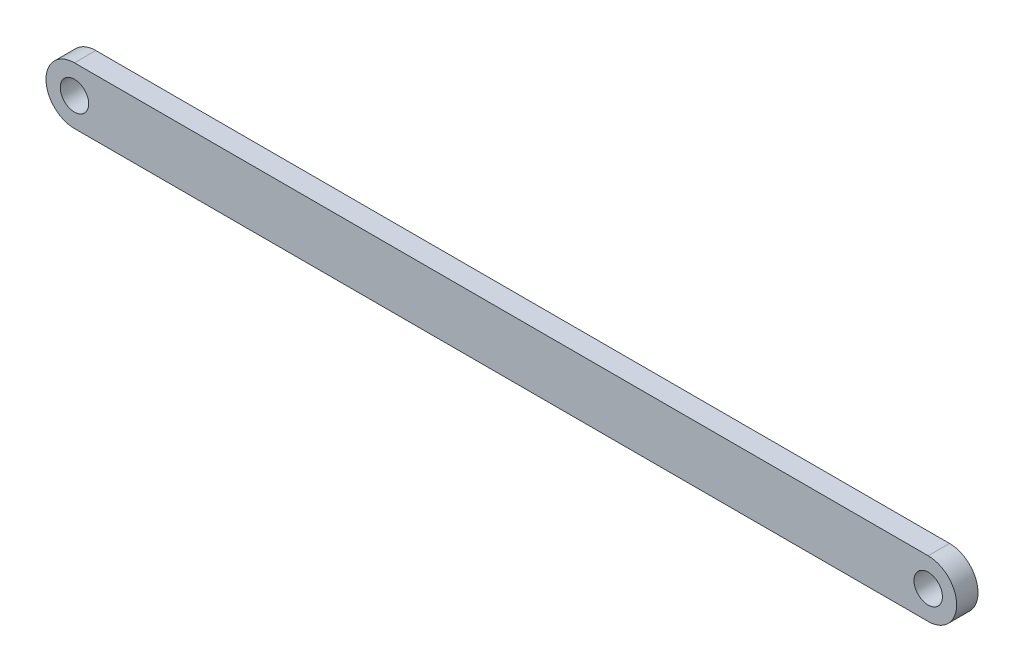
ISO-10303-21;
HEADER;
FILE_DESCRIPTION(('STEP AP214'),'2;1');
FILE_NAME('part.step','',(''),(''),'','','');
FILE_SCHEMA(('AUTOMOTIVE_DESIGN { 1 0 10303 214 1 1 1 1 }'));
ENDSEC;
DATA;
#1=APPLICATION_CONTEXT('core data for automotive mechanical design processes');
#2=APPLICATION_PROTOCOL_DEFINITION('international standard','automotive_design',2000,#1);
#3=PRODUCT_CONTEXT('',#1,'mechanical');
#4=PRODUCT('Part','Part','',(#3));
#5=PRODUCT_RELATED_PRODUCT_CATEGORY('part','',(#4));
#6=PRODUCT_DEFINITION_FORMATION('','',#4);
#7=PRODUCT_DEFINITION_CONTEXT('part definition',#1,'design');
#8=PRODUCT_DEFINITION('design','',#6,#7);
#9=PRODUCT_DEFINITION_SHAPE('','',#8);
#10=(LENGTH_UNIT() NAMED_UNIT(*) SI_UNIT(.MILLI.,.METRE.));
#11=(NAMED_UNIT(*) PLANE_ANGLE_UNIT() SI_UNIT($,.RADIAN.));
#12=(NAMED_UNIT(*) SI_UNIT($,.STERADIAN.) SOLID_ANGLE_UNIT());
#13=UNCERTAINTY_MEASURE_WITH_UNIT(LENGTH_MEASURE(1.E-05),#10,'distance_accuracy_value','');
#14=(GEOMETRIC_REPRESENTATION_CONTEXT(3) GLOBAL_UNCERTAINTY_ASSIGNED_CONTEXT((#13)) GLOBAL_UNIT_ASSIGNED_CONTEXT((#10,
#11,#12)) REPRESENTATION_CONTEXT('',''));
#15=CARTESIAN_POINT('',(0.,0.,0.));
#16=DIRECTION('',(0.,0.,1.));
#17=DIRECTION('',(1.,0.,0.));
#18=AXIS2_PLACEMENT_3D('',#15,#16,#17);
#19=CARTESIAN_POINT('',(0.,0.,1.5));
#20=DIRECTION('',(0.,0.,1.));
#21=DIRECTION('',(1.,0.,0.));
#22=AXIS2_PLACEMENT_3D('',#19,#20,#21);
#23=PLANE('',#22);
#24=CARTESIAN_POINT('',(60.,0.,1.5));
#25=DIRECTION('',(0.,0.,1.));
#26=DIRECTION('',(1.,0.,0.));
#27=AXIS2_PLACEMENT_3D('',#24,#25,#26);
#28=CIRCLE('',#27,0.999999999999998);
#29=CARTESIAN_POINT('',(61.,0.,1.5));
#30=VERTEX_POINT('',#29);
#31=EDGE_CURVE('E101',#30,#30,#28,.T.);
#32=ORIENTED_EDGE('',*,*,#31,.F.);
#33=EDGE_LOOP('',(#32));
#34=FACE_BOUND('',#33,.T.);
#35=CARTESIAN_POINT('',(0.,0.,1.5));
#36=DIRECTION('',(0.,0.,1.));
#37=DIRECTION('',(1.,0.,0.));
#38=AXIS2_PLACEMENT_3D('',#35,#36,#37);
#39=CIRCLE('',#38,2.);
#40=CARTESIAN_POINT('',(0.,2.,1.5));
#41=VERTEX_POINT('',#40);
#42=CARTESIAN_POINT('',(0.,-2.,1.5));
#43=VERTEX_POINT('',#42);
#44=EDGE_CURVE('E86',#41,#43,#39,.T.);
#45=ORIENTED_EDGE('',*,*,#44,.T.);
#46=DIRECTION('',(1.,0.,0.));
#47=VECTOR('',#46,1.);
#48=CARTESIAN_POINT('',(0.,-2.,1.5));
#49=LINE('',#48,#47);
#50=CARTESIAN_POINT('',(60.,-2.,1.5));
#51=VERTEX_POINT('',#50);
#52=EDGE_CURVE('E81',#43,#51,#49,.T.);
#53=ORIENTED_EDGE('',*,*,#52,.T.);
#54=CARTESIAN_POINT('',(60.,0.,1.5));
#55=DIRECTION('',(0.,0.,1.));
#56=DIRECTION('',(1.,0.,0.));
#57=AXIS2_PLACEMENT_3D('',#54,#55,#56);
#58=CIRCLE('',#57,2.);
#59=CARTESIAN_POINT('',(60.,2.,1.5));
#60=VERTEX_POINT('',#59);
#61=EDGE_CURVE('E84',#51,#60,#58,.T.);
#62=ORIENTED_EDGE('',*,*,#61,.T.);
#63=DIRECTION('',(-1.,0.,0.));
#64=VECTOR('',#63,1.);
#65=CARTESIAN_POINT('',(0.,2.,1.5));
#66=LINE('',#65,#64);
#67=EDGE_CURVE('E51',#60,#41,#66,.T.);
#68=ORIENTED_EDGE('',*,*,#67,.T.);
#69=EDGE_LOOP('',(#45,#53,#62,#68));
#70=FACE_BOUND('',#69,.T.);
#71=CARTESIAN_POINT('',(0.,0.,1.5));
#72=DIRECTION('',(0.,0.,1.));
#73=DIRECTION('',(1.,0.,0.));
#74=AXIS2_PLACEMENT_3D('',#71,#72,#73);
#75=CIRCLE('',#74,1.);
#76=CARTESIAN_POINT('',(1.,0.,1.5));
#77=VERTEX_POINT('',#76);
#78=EDGE_CURVE('E116',#77,#77,#75,.T.);
#79=ORIENTED_EDGE('',*,*,#78,.F.);
#80=EDGE_LOOP('',(#79));
#81=FACE_BOUND('',#80,.T.);
#82=ADVANCED_FACE('F34',(#34,#70,#81),#23,.T.);
#83=CARTESIAN_POINT('',(0.,0.,0.));
#84=DIRECTION('',(0.,0.,1.));
#85=DIRECTION('',(1.,0.,0.));
#86=AXIS2_PLACEMENT_3D('',#83,#84,#85);
#87=PLANE('',#86);
#88=CARTESIAN_POINT('',(0.,0.,0.));
#89=DIRECTION('',(0.,0.,1.));
#90=DIRECTION('',(1.,0.,0.));
#91=AXIS2_PLACEMENT_3D('',#88,#89,#90);
#92=CIRCLE('',#91,2.);
#93=CARTESIAN_POINT('',(0.,2.,0.));
#94=VERTEX_POINT('',#93);
#95=CARTESIAN_POINT('',(0.,-2.,0.));
#96=VERTEX_POINT('',#95);
#97=EDGE_CURVE('E98',#94,#96,#92,.T.);
#98=ORIENTED_EDGE('',*,*,#97,.F.);
#99=DIRECTION('',(-1.,0.,0.));
#100=VECTOR('',#99,1.);
#101=CARTESIAN_POINT('',(0.,2.,0.));
#102=LINE('',#101,#100);
#103=CARTESIAN_POINT('',(60.,2.,0.));
#104=VERTEX_POINT('',#103);
#105=EDGE_CURVE('E74',#104,#94,#102,.T.);
#106=ORIENTED_EDGE('',*,*,#105,.F.);
#107=CARTESIAN_POINT('',(60.,0.,0.));
#108=DIRECTION('',(0.,0.,1.));
#109=DIRECTION('',(1.,0.,0.));
#110=AXIS2_PLACEMENT_3D('',#107,#108,#109);
#111=CIRCLE('',#110,2.);
#112=CARTESIAN_POINT('',(60.,-2.,0.));
#113=VERTEX_POINT('',#112);
#114=EDGE_CURVE('E68',#113,#104,#111,.T.);
#115=ORIENTED_EDGE('',*,*,#114,.F.);
#116=DIRECTION('',(1.,0.,0.));
#117=VECTOR('',#116,1.);
#118=CARTESIAN_POINT('',(0.,-2.,0.));
#119=LINE('',#118,#117);
#120=EDGE_CURVE('E90',#96,#113,#119,.T.);
#121=ORIENTED_EDGE('',*,*,#120,.F.);
#122=EDGE_LOOP('',(#98,#106,#115,#121));
#123=FACE_BOUND('',#122,.T.);
#124=CARTESIAN_POINT('',(60.,0.,0.));
#125=DIRECTION('',(0.,0.,1.));
#126=DIRECTION('',(1.,0.,0.));
#127=AXIS2_PLACEMENT_3D('',#124,#125,#126);
#128=CIRCLE('',#127,0.999999999999998);
#129=CARTESIAN_POINT('',(61.,0.,0.));
#130=VERTEX_POINT('',#129);
#131=EDGE_CURVE('E113',#130,#130,#128,.T.);
#132=ORIENTED_EDGE('',*,*,#131,.T.);
#133=EDGE_LOOP('',(#132));
#134=FACE_BOUND('',#133,.T.);
#135=CARTESIAN_POINT('',(0.,0.,0.));
#136=DIRECTION('',(0.,0.,1.));
#137=DIRECTION('',(1.,0.,0.));
#138=AXIS2_PLACEMENT_3D('',#135,#136,#137);
#139=CIRCLE('',#138,1.);
#140=CARTESIAN_POINT('',(1.,0.,0.));
#141=VERTEX_POINT('',#140);
#142=EDGE_CURVE('E119',#141,#141,#139,.T.);
#143=ORIENTED_EDGE('',*,*,#142,.T.);
#144=EDGE_LOOP('',(#143));
#145=FACE_BOUND('',#144,.T.);
#146=ADVANCED_FACE('F109',(#123,#134,#145),#87,.F.);
#147=CARTESIAN_POINT('',(0.,0.,1.5));
#148=DIRECTION('',(0.,0.,-1.));
#149=DIRECTION('',(-1.,0.,0.));
#150=AXIS2_PLACEMENT_3D('',#147,#148,#149);
#151=CYLINDRICAL_SURFACE('',#150,2.);
#152=ORIENTED_EDGE('',*,*,#97,.T.);
#153=DIRECTION('',(0.,0.,-1.));
#154=VECTOR('',#153,1.);
#155=CARTESIAN_POINT('',(0.,-2.,1.5));
#156=LINE('',#155,#154);
#157=EDGE_CURVE('E11',#43,#96,#156,.T.);
#158=ORIENTED_EDGE('',*,*,#157,.F.);
#159=ORIENTED_EDGE('',*,*,#44,.F.);
#160=DIRECTION('',(0.,0.,-1.));
#161=VECTOR('',#160,1.);
#162=CARTESIAN_POINT('',(0.,2.,1.5));
#163=LINE('',#162,#161);
#164=EDGE_CURVE('E94',#41,#94,#163,.T.);
#165=ORIENTED_EDGE('',*,*,#164,.T.);
#166=EDGE_LOOP('',(#152,#158,#159,#165));
#167=FACE_BOUND('',#166,.T.);
#168=ADVANCED_FACE('F36',(#167),#151,.T.);
#169=CARTESIAN_POINT('',(0.,-2.,1.5));
#170=DIRECTION('',(0.,1.,0.));
#171=DIRECTION('',(0.,0.,1.));
#172=AXIS2_PLACEMENT_3D('',#169,#170,#171);
#173=PLANE('',#172);
#174=ORIENTED_EDGE('',*,*,#120,.T.);
#175=DIRECTION('',(0.,0.,-1.));
#176=VECTOR('',#175,1.);
#177=CARTESIAN_POINT('',(60.,-2.,1.5));
#178=LINE('',#177,#176);
#179=EDGE_CURVE('E43',#51,#113,#178,.T.);
#180=ORIENTED_EDGE('',*,*,#179,.F.);
#181=ORIENTED_EDGE('',*,*,#52,.F.);
#182=ORIENTED_EDGE('',*,*,#157,.T.);
#183=EDGE_LOOP('',(#174,#180,#181,#182));
#184=FACE_BOUND('',#183,.T.);
#185=ADVANCED_FACE('F89',(#184),#173,.F.);
#186=CARTESIAN_POINT('',(60.,0.,1.5));
#187=DIRECTION('',(0.,0.,-1.));
#188=DIRECTION('',(-1.,0.,0.));
#189=AXIS2_PLACEMENT_3D('',#186,#187,#188);
#190=CYLINDRICAL_SURFACE('',#189,2.);
#191=ORIENTED_EDGE('',*,*,#114,.T.);
#192=DIRECTION('',(0.,0.,-1.));
#193=VECTOR('',#192,1.);
#194=CARTESIAN_POINT('',(60.,2.,1.5));
#195=LINE('',#194,#193);
#196=EDGE_CURVE('E91',#60,#104,#195,.T.);
#197=ORIENTED_EDGE('',*,*,#196,.F.);
#198=ORIENTED_EDGE('',*,*,#61,.F.);
#199=ORIENTED_EDGE('',*,*,#179,.T.);
#200=EDGE_LOOP('',(#191,#197,#198,#199));
#201=FACE_BOUND('',#200,.T.);
#202=ADVANCED_FACE('F92',(#201),#190,.T.);
#203=CARTESIAN_POINT('',(0.,2.,1.5));
#204=DIRECTION('',(0.,-1.,0.));
#205=DIRECTION('',(0.,0.,-1.));
#206=AXIS2_PLACEMENT_3D('',#203,#204,#205);
#207=PLANE('',#206);
#208=ORIENTED_EDGE('',*,*,#105,.T.);
#209=ORIENTED_EDGE('',*,*,#164,.F.);
#210=ORIENTED_EDGE('',*,*,#67,.F.);
#211=ORIENTED_EDGE('',*,*,#196,.T.);
#212=EDGE_LOOP('',(#208,#209,#210,#211));
#213=FACE_BOUND('',#212,.T.);
#214=ADVANCED_FACE('F106',(#213),#207,.F.);
#215=CARTESIAN_POINT('',(60.,0.,1.5));
#216=DIRECTION('',(0.,0.,-1.));
#217=DIRECTION('',(-1.,0.,0.));
#218=AXIS2_PLACEMENT_3D('',#215,#216,#217);
#219=CYLINDRICAL_SURFACE('',#218,0.999999999999998);
#220=ORIENTED_EDGE('',*,*,#31,.T.);
#221=EDGE_LOOP('',(#220));
#222=FACE_BOUND('',#221,.T.);
#223=ORIENTED_EDGE('',*,*,#131,.F.);
#224=EDGE_LOOP('',(#223));
#225=FACE_BOUND('',#224,.T.);
#226=ADVANCED_FACE('F136',(#222,#225),#219,.F.);
#227=CARTESIAN_POINT('',(0.,0.,1.5));
#228=DIRECTION('',(0.,0.,-1.));
#229=DIRECTION('',(-1.,0.,0.));
#230=AXIS2_PLACEMENT_3D('',#227,#228,#229);
#231=CYLINDRICAL_SURFACE('',#230,1.);
#232=ORIENTED_EDGE('',*,*,#78,.T.);
#233=EDGE_LOOP('',(#232));
#234=FACE_BOUND('',#233,.T.);
#235=ORIENTED_EDGE('',*,*,#142,.F.);
#236=EDGE_LOOP('',(#235));
#237=FACE_BOUND('',#236,.T.);
#238=ADVANCED_FACE('F125',(#234,#237),#231,.F.);
#239=CLOSED_SHELL('',(#82,#146,#168,#185,#202,#214,#226,#238));
#240=MANIFOLD_SOLID_BREP('B2',#239);
#241=ADVANCED_BREP_SHAPE_REPRESENTATION('',(#18,#240),#14);
#242=SHAPE_DEFINITION_REPRESENTATION(#9,#241);
ENDSEC;
END-ISO-10303-21;
